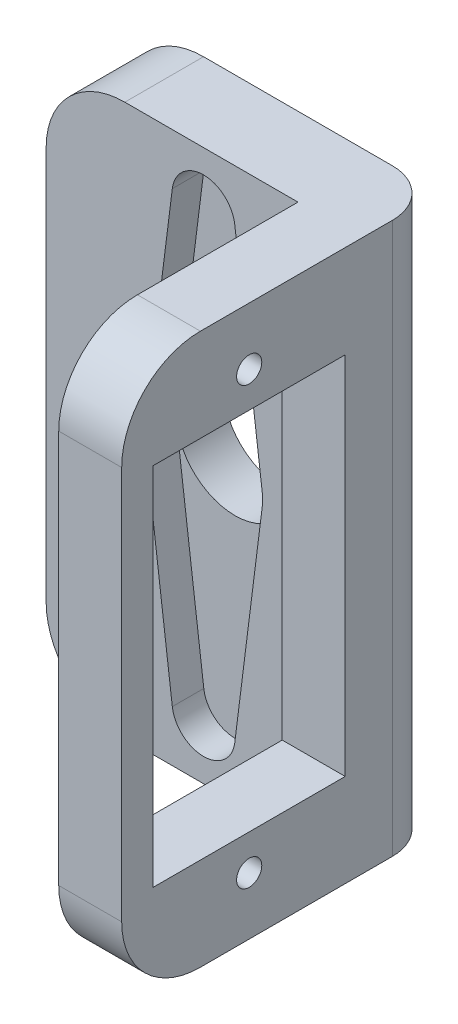
ISO-10303-21;
HEADER;
FILE_DESCRIPTION(('STEP AP214'),'2;1');
FILE_NAME('part.step','',(''),(''),'','','');
FILE_SCHEMA(('AUTOMOTIVE_DESIGN { 1 0 10303 214 1 1 1 1 }'));
ENDSEC;
DATA;
#1=APPLICATION_CONTEXT('core data for automotive mechanical design processes');
#2=APPLICATION_PROTOCOL_DEFINITION('international standard','automotive_design',2000,#1);
#3=PRODUCT_CONTEXT('',#1,'mechanical');
#4=PRODUCT('Part','Part','',(#3));
#5=PRODUCT_RELATED_PRODUCT_CATEGORY('part','',(#4));
#6=PRODUCT_DEFINITION_FORMATION('','',#4);
#7=PRODUCT_DEFINITION_CONTEXT('part definition',#1,'design');
#8=PRODUCT_DEFINITION('design','',#6,#7);
#9=PRODUCT_DEFINITION_SHAPE('','',#8);
#10=(LENGTH_UNIT() NAMED_UNIT(*) SI_UNIT(.MILLI.,.METRE.));
#11=(NAMED_UNIT(*) PLANE_ANGLE_UNIT() SI_UNIT($,.RADIAN.));
#12=(NAMED_UNIT(*) SI_UNIT($,.STERADIAN.) SOLID_ANGLE_UNIT());
#13=UNCERTAINTY_MEASURE_WITH_UNIT(LENGTH_MEASURE(1.E-05),#10,'distance_accuracy_value','');
#14=(GEOMETRIC_REPRESENTATION_CONTEXT(3) GLOBAL_UNCERTAINTY_ASSIGNED_CONTEXT((#13)) GLOBAL_UNIT_ASSIGNED_CONTEXT((#10,
#11,#12)) REPRESENTATION_CONTEXT('',''));
#15=CARTESIAN_POINT('',(0.,0.,0.));
#16=DIRECTION('',(0.,0.,1.));
#17=DIRECTION('',(1.,0.,0.));
#18=AXIS2_PLACEMENT_3D('',#15,#16,#17);
#19=CARTESIAN_POINT('',(-5.,12.5,0.));
#20=DIRECTION('',(0.,0.,1.));
#21=DIRECTION('',(1.,0.,0.));
#22=AXIS2_PLACEMENT_3D('',#19,#20,#21);
#23=PLANE('',#22);
#24=DIRECTION('',(-0.125,-0.992156741649221,0.));
#25=VECTOR('',#24,1.);
#26=CARTESIAN_POINT('',(-1.98431348329844,14.25,0.));
#27=LINE('',#26,#25);
#28=CARTESIAN_POINT('',(-1.98431348329844,14.25,0.));
#29=VERTEX_POINT('',#28);
#30=CARTESIAN_POINT('',(-3.72058778118458,0.46875,0.));
#31=VERTEX_POINT('',#30);
#32=EDGE_CURVE('E309',#29,#31,#27,.T.);
#33=ORIENTED_EDGE('',*,*,#32,.F.);
#34=CARTESIAN_POINT('',(0.,14.,0.));
#35=DIRECTION('',(0.,0.,1.));
#36=DIRECTION('',(1.,0.,0.));
#37=AXIS2_PLACEMENT_3D('',#34,#35,#36);
#38=CIRCLE('',#37,2.);
#39=CARTESIAN_POINT('',(1.98431348329844,14.25,0.));
#40=VERTEX_POINT('',#39);
#41=EDGE_CURVE('E342',#40,#29,#38,.T.);
#42=ORIENTED_EDGE('',*,*,#41,.F.);
#43=DIRECTION('',(-0.125,0.992156741649221,0.));
#44=VECTOR('',#43,1.);
#45=CARTESIAN_POINT('',(1.98431348329844,14.25,0.));
#46=LINE('',#45,#44);
#47=CARTESIAN_POINT('',(3.72058778118458,0.46875,0.));
#48=VERTEX_POINT('',#47);
#49=EDGE_CURVE('E338',#48,#40,#46,.T.);
#50=ORIENTED_EDGE('',*,*,#49,.F.);
#51=CARTESIAN_POINT('',(0.,0.,0.));
#52=DIRECTION('',(0.,0.,1.));
#53=DIRECTION('',(1.,0.,0.));
#54=AXIS2_PLACEMENT_3D('',#51,#52,#53);
#55=CIRCLE('',#54,3.75);
#56=CARTESIAN_POINT('',(3.72058778118458,-0.468750000000001,0.));
#57=VERTEX_POINT('',#56);
#58=EDGE_CURVE('E352',#57,#48,#55,.T.);
#59=ORIENTED_EDGE('',*,*,#58,.F.);
#60=DIRECTION('',(0.125,0.992156741649221,0.));
#61=VECTOR('',#60,1.);
#62=CARTESIAN_POINT('',(1.98431348329844,-14.25,0.));
#63=LINE('',#62,#61);
#64=CARTESIAN_POINT('',(1.98431348329844,-14.25,0.));
#65=VERTEX_POINT('',#64);
#66=EDGE_CURVE('E335',#65,#57,#63,.T.);
#67=ORIENTED_EDGE('',*,*,#66,.F.);
#68=CARTESIAN_POINT('',(0.,-14.,0.));
#69=DIRECTION('',(0.,0.,1.));
#70=DIRECTION('',(1.,0.,0.));
#71=AXIS2_PLACEMENT_3D('',#68,#69,#70);
#72=CIRCLE('',#71,2.);
#73=CARTESIAN_POINT('',(-1.98431348329844,-14.25,0.));
#74=VERTEX_POINT('',#73);
#75=EDGE_CURVE('E331',#74,#65,#72,.T.);
#76=ORIENTED_EDGE('',*,*,#75,.F.);
#77=DIRECTION('',(0.125,-0.992156741649221,0.));
#78=VECTOR('',#77,1.);
#79=CARTESIAN_POINT('',(-3.72058778118458,-0.46875,0.));
#80=LINE('',#79,#78);
#81=CARTESIAN_POINT('',(-3.72058778118458,-0.46875,0.));
#82=VERTEX_POINT('',#81);
#83=EDGE_CURVE('E294',#82,#74,#80,.T.);
#84=ORIENTED_EDGE('',*,*,#83,.F.);
#85=EDGE_CURVE('E379',#31,#82,#55,.T.);
#86=ORIENTED_EDGE('',*,*,#85,.F.);
#87=EDGE_LOOP('',(#33,#42,#50,#59,#67,#76,#84,#86));
#88=FACE_BOUND('',#87,.T.);
#89=DIRECTION('',(1.,0.,0.));
#90=VECTOR('',#89,1.);
#91=CARTESIAN_POINT('',(10.,-17.5,0.));
#92=LINE('',#91,#90);
#93=CARTESIAN_POINT('',(-5.,-17.5,0.));
#94=VERTEX_POINT('',#93);
#95=CARTESIAN_POINT('',(6.,-17.5,0.));
#96=VERTEX_POINT('',#95);
#97=EDGE_CURVE('E387',#94,#96,#92,.T.);
#98=ORIENTED_EDGE('',*,*,#97,.T.);
#99=DIRECTION('',(0.,1.,0.));
#100=VECTOR('',#99,1.);
#101=CARTESIAN_POINT('',(6.,12.5,0.));
#102=LINE('',#101,#100);
#103=CARTESIAN_POINT('',(6.,17.5,0.));
#104=VERTEX_POINT('',#103);
#105=EDGE_CURVE('E441',#96,#104,#102,.T.);
#106=ORIENTED_EDGE('',*,*,#105,.T.);
#107=DIRECTION('',(-1.,0.,0.));
#108=VECTOR('',#107,1.);
#109=CARTESIAN_POINT('',(10.,17.5,0.));
#110=LINE('',#109,#108);
#111=CARTESIAN_POINT('',(-5.,17.5,0.));
#112=VERTEX_POINT('',#111);
#113=EDGE_CURVE('E378',#104,#112,#110,.T.);
#114=ORIENTED_EDGE('',*,*,#113,.T.);
#115=CARTESIAN_POINT('',(-5.,12.5,0.));
#116=DIRECTION('',(0.,0.,1.));
#117=DIRECTION('',(1.,0.,0.));
#118=AXIS2_PLACEMENT_3D('',#115,#116,#117);
#119=CIRCLE('',#118,5.);
#120=CARTESIAN_POINT('',(-10.,12.5,0.));
#121=VERTEX_POINT('',#120);
#122=EDGE_CURVE('E405',#112,#121,#119,.T.);
#123=ORIENTED_EDGE('',*,*,#122,.T.);
#124=DIRECTION('',(0.,-1.,0.));
#125=VECTOR('',#124,1.);
#126=CARTESIAN_POINT('',(-10.,-12.5,0.));
#127=LINE('',#126,#125);
#128=CARTESIAN_POINT('',(-10.,-12.5,0.));
#129=VERTEX_POINT('',#128);
#130=EDGE_CURVE('E409',#121,#129,#127,.T.);
#131=ORIENTED_EDGE('',*,*,#130,.T.);
#132=CARTESIAN_POINT('',(-5.,-12.5,0.));
#133=DIRECTION('',(0.,0.,1.));
#134=DIRECTION('',(-1.,0.,0.));
#135=AXIS2_PLACEMENT_3D('',#132,#133,#134);
#136=CIRCLE('',#135,5.);
#137=EDGE_CURVE('E413',#129,#94,#136,.T.);
#138=ORIENTED_EDGE('',*,*,#137,.T.);
#139=EDGE_LOOP('',(#98,#106,#114,#123,#131,#138));
#140=FACE_BOUND('',#139,.T.);
#141=ADVANCED_FACE('F45',(#88,#140),#23,.T.);
#142=CARTESIAN_POINT('',(0.,0.,-5.));
#143=DIRECTION('',(0.,0.,1.));
#144=DIRECTION('',(1.,0.,0.));
#145=AXIS2_PLACEMENT_3D('',#142,#143,#144);
#146=CYLINDRICAL_SURFACE('',#145,3.75);
#147=CARTESIAN_POINT('',(0.,0.,-5.));
#148=DIRECTION('',(0.,0.,1.));
#149=DIRECTION('',(1.,0.,0.));
#150=AXIS2_PLACEMENT_3D('',#147,#148,#149);
#151=CIRCLE('',#150,3.75);
#152=CARTESIAN_POINT('',(3.75,0.,-5.));
#153=VERTEX_POINT('',#152);
#154=EDGE_CURVE('E374',#153,#153,#151,.T.);
#155=ORIENTED_EDGE('',*,*,#154,.F.);
#156=EDGE_LOOP('',(#155));
#157=FACE_BOUND('',#156,.T.);
#158=CARTESIAN_POINT('',(0.,0.,-2.));
#159=DIRECTION('',(0.,0.,1.));
#160=DIRECTION('',(1.,0.,0.));
#161=AXIS2_PLACEMENT_3D('',#158,#159,#160);
#162=CIRCLE('',#161,3.75);
#163=CARTESIAN_POINT('',(3.72058778118458,-0.468750000000001,-2.));
#164=VERTEX_POINT('',#163);
#165=CARTESIAN_POINT('',(-3.72058778118458,-0.46875,-2.));
#166=VERTEX_POINT('',#165);
#167=EDGE_CURVE('E438',#164,#166,#162,.F.);
#168=ORIENTED_EDGE('',*,*,#167,.F.);
#169=DIRECTION('',(0.,0.,1.));
#170=VECTOR('',#169,1.);
#171=CARTESIAN_POINT('',(3.72058778118458,-0.468750000000001,-2.));
#172=LINE('',#171,#170);
#173=EDGE_CURVE('E362',#164,#57,#172,.T.);
#174=ORIENTED_EDGE('',*,*,#173,.T.);
#175=ORIENTED_EDGE('',*,*,#58,.T.);
#176=DIRECTION('',(0.,0.,1.));
#177=VECTOR('',#176,1.);
#178=CARTESIAN_POINT('',(3.72058778118458,0.46875,-2.));
#179=LINE('',#178,#177);
#180=CARTESIAN_POINT('',(3.72058778118458,0.46875,-2.));
#181=VERTEX_POINT('',#180);
#182=EDGE_CURVE('E359',#181,#48,#179,.T.);
#183=ORIENTED_EDGE('',*,*,#182,.F.);
#184=CARTESIAN_POINT('',(-3.72058778118458,0.46875,-2.));
#185=VERTEX_POINT('',#184);
#186=EDGE_CURVE('E422',#185,#181,#162,.F.);
#187=ORIENTED_EDGE('',*,*,#186,.F.);
#188=DIRECTION('',(0.,0.,1.));
#189=VECTOR('',#188,1.);
#190=CARTESIAN_POINT('',(-3.72058778118458,0.46875,-2.));
#191=LINE('',#190,#189);
#192=EDGE_CURVE('E348',#185,#31,#191,.T.);
#193=ORIENTED_EDGE('',*,*,#192,.T.);
#194=ORIENTED_EDGE('',*,*,#85,.T.);
#195=DIRECTION('',(0.,0.,1.));
#196=VECTOR('',#195,1.);
#197=CARTESIAN_POINT('',(-3.72058778118458,-0.46875,-2.));
#198=LINE('',#197,#196);
#199=EDGE_CURVE('E327',#166,#82,#198,.T.);
#200=ORIENTED_EDGE('',*,*,#199,.F.);
#201=EDGE_LOOP('',(#168,#174,#175,#183,#187,#193,#194,#200));
#202=FACE_BOUND('',#201,.T.);
#203=ADVANCED_FACE('F457',(#157,#202),#146,.F.);
#204=CARTESIAN_POINT('',(10.,-17.5,-5.));
#205=DIRECTION('',(1.,0.,0.));
#206=DIRECTION('',(0.,0.,-1.));
#207=AXIS2_PLACEMENT_3D('',#204,#205,#206);
#208=PLANE('',#207);
#209=DIRECTION('',(0.,0.,1.));
#210=VECTOR('',#209,1.);
#211=CARTESIAN_POINT('',(10.,-17.5,-5.));
#212=LINE('',#211,#210);
#213=CARTESIAN_POINT('',(10.,-17.5,-2.));
#214=VERTEX_POINT('',#213);
#215=CARTESIAN_POINT('',(10.,-17.5,10.2));
#216=VERTEX_POINT('',#215);
#217=EDGE_CURVE('E419',#214,#216,#212,.T.);
#218=ORIENTED_EDGE('',*,*,#217,.F.);
#219=DIRECTION('',(0.,1.,0.));
#220=VECTOR('',#219,1.);
#221=CARTESIAN_POINT('',(10.,17.5,-2.));
#222=LINE('',#221,#220);
#223=CARTESIAN_POINT('',(10.,17.5,-2.));
#224=VERTEX_POINT('',#223);
#225=EDGE_CURVE('E444',#214,#224,#222,.T.);
#226=ORIENTED_EDGE('',*,*,#225,.T.);
#227=DIRECTION('',(0.,0.,1.));
#228=VECTOR('',#227,1.);
#229=CARTESIAN_POINT('',(10.,17.5,-5.));
#230=LINE('',#229,#228);
#231=CARTESIAN_POINT('',(10.,17.5,10.2));
#232=VERTEX_POINT('',#231);
#233=EDGE_CURVE('E402',#224,#232,#230,.T.);
#234=ORIENTED_EDGE('',*,*,#233,.T.);
#235=CARTESIAN_POINT('',(10.,12.5,10.2));
#236=DIRECTION('',(1.,0.,0.));
#237=DIRECTION('',(0.,0.,1.));
#238=AXIS2_PLACEMENT_3D('',#235,#236,#237);
#239=CIRCLE('',#238,5.);
#240=CARTESIAN_POINT('',(10.,12.5,15.2));
#241=VERTEX_POINT('',#240);
#242=EDGE_CURVE('E253',#232,#241,#239,.T.);
#243=ORIENTED_EDGE('',*,*,#242,.T.);
#244=DIRECTION('',(0.,-1.,0.));
#245=VECTOR('',#244,1.);
#246=CARTESIAN_POINT('',(10.,12.5,15.2));
#247=LINE('',#246,#245);
#248=CARTESIAN_POINT('',(10.,-12.5,15.2));
#249=VERTEX_POINT('',#248);
#250=EDGE_CURVE('E283',#241,#249,#247,.T.);
#251=ORIENTED_EDGE('',*,*,#250,.T.);
#252=CARTESIAN_POINT('',(10.,-12.5,10.2));
#253=DIRECTION('',(1.,0.,0.));
#254=DIRECTION('',(0.,0.,-1.));
#255=AXIS2_PLACEMENT_3D('',#252,#253,#254);
#256=CIRCLE('',#255,5.);
#257=EDGE_CURVE('E263',#249,#216,#256,.T.);
#258=ORIENTED_EDGE('',*,*,#257,.T.);
#259=EDGE_LOOP('',(#218,#226,#234,#243,#251,#258));
#260=FACE_BOUND('',#259,.T.);
#261=CARTESIAN_POINT('',(10.,-13.85,7.1));
#262=DIRECTION('',(1.,0.,0.));
#263=DIRECTION('',(0.,0.,-1.));
#264=AXIS2_PLACEMENT_3D('',#261,#262,#263);
#265=CIRCLE('',#264,0.800000000000002);
#266=CARTESIAN_POINT('',(10.,-13.85,6.3));
#267=VERTEX_POINT('',#266);
#268=EDGE_CURVE('E539',#267,#267,#265,.T.);
#269=ORIENTED_EDGE('',*,*,#268,.F.);
#270=EDGE_LOOP('',(#269));
#271=FACE_BOUND('',#270,.T.);
#272=CARTESIAN_POINT('',(10.,13.85,7.10000000000001));
#273=DIRECTION('',(1.,0.,0.));
#274=DIRECTION('',(0.,0.,-1.));
#275=AXIS2_PLACEMENT_3D('',#272,#273,#274);
#276=CIRCLE('',#275,0.800000000000002);
#277=CARTESIAN_POINT('',(10.,13.85,6.30000000000001));
#278=VERTEX_POINT('',#277);
#279=EDGE_CURVE('E234',#278,#278,#276,.T.);
#280=ORIENTED_EDGE('',*,*,#279,.F.);
#281=EDGE_LOOP('',(#280));
#282=FACE_BOUND('',#281,.T.);
#283=DIRECTION('',(0.,1.,0.));
#284=VECTOR('',#283,1.);
#285=CARTESIAN_POINT('',(10.,-11.6,1.));
#286=LINE('',#285,#284);
#287=CARTESIAN_POINT('',(10.,-11.6,1.));
#288=VERTEX_POINT('',#287);
#289=CARTESIAN_POINT('',(10.,11.6,0.999999999999999));
#290=VERTEX_POINT('',#289);
#291=EDGE_CURVE('E207',#288,#290,#286,.T.);
#292=ORIENTED_EDGE('',*,*,#291,.F.);
#293=DIRECTION('',(0.,0.,-1.));
#294=VECTOR('',#293,1.);
#295=CARTESIAN_POINT('',(10.,-11.6,13.2));
#296=LINE('',#295,#294);
#297=CARTESIAN_POINT('',(10.,-11.6,13.2));
#298=VERTEX_POINT('',#297);
#299=EDGE_CURVE('E227',#298,#288,#296,.T.);
#300=ORIENTED_EDGE('',*,*,#299,.F.);
#301=DIRECTION('',(0.,-1.,0.));
#302=VECTOR('',#301,1.);
#303=CARTESIAN_POINT('',(10.,-11.6,13.2));
#304=LINE('',#303,#302);
#305=CARTESIAN_POINT('',(10.,11.6,13.2));
#306=VERTEX_POINT('',#305);
#307=EDGE_CURVE('E231',#306,#298,#304,.T.);
#308=ORIENTED_EDGE('',*,*,#307,.F.);
#309=DIRECTION('',(0.,0.,1.));
#310=VECTOR('',#309,1.);
#311=CARTESIAN_POINT('',(10.,11.6,13.2));
#312=LINE('',#311,#310);
#313=EDGE_CURVE('E243',#290,#306,#312,.T.);
#314=ORIENTED_EDGE('',*,*,#313,.F.);
#315=EDGE_LOOP('',(#292,#300,#308,#314));
#316=FACE_BOUND('',#315,.T.);
#317=ADVANCED_FACE('F505',(#260,#271,#282,#316),#208,.T.);
#318=CARTESIAN_POINT('',(10.,-17.5,-5.));
#319=DIRECTION('',(0.,-1.,0.));
#320=DIRECTION('',(1.,0.,0.));
#321=AXIS2_PLACEMENT_3D('',#318,#319,#320);
#322=PLANE('',#321);
#323=DIRECTION('',(1.,0.,0.));
#324=VECTOR('',#323,1.);
#325=CARTESIAN_POINT('',(10.,-17.5,-5.));
#326=LINE('',#325,#324);
#327=CARTESIAN_POINT('',(-5.,-17.5,-5.));
#328=VERTEX_POINT('',#327);
#329=CARTESIAN_POINT('',(7.,-17.5,-5.));
#330=VERTEX_POINT('',#329);
#331=EDGE_CURVE('E399',#328,#330,#326,.T.);
#332=ORIENTED_EDGE('',*,*,#331,.T.);
#333=CARTESIAN_POINT('',(7.,-17.5,-2.));
#334=DIRECTION('',(0.,-1.,0.));
#335=DIRECTION('',(1.,0.,0.));
#336=AXIS2_PLACEMENT_3D('',#333,#334,#335);
#337=CIRCLE('',#336,3.);
#338=EDGE_CURVE('E11',#330,#214,#337,.T.);
#339=ORIENTED_EDGE('',*,*,#338,.T.);
#340=ORIENTED_EDGE('',*,*,#217,.T.);
#341=DIRECTION('',(1.,0.,0.));
#342=VECTOR('',#341,1.);
#343=CARTESIAN_POINT('',(6.,-17.5,10.2));
#344=LINE('',#343,#342);
#345=CARTESIAN_POINT('',(6.,-17.5,10.2));
#346=VERTEX_POINT('',#345);
#347=EDGE_CURVE('E290',#346,#216,#344,.T.);
#348=ORIENTED_EDGE('',*,*,#347,.F.);
#349=DIRECTION('',(0.,0.,-1.));
#350=VECTOR('',#349,1.);
#351=CARTESIAN_POINT('',(6.,-17.5,-5.));
#352=LINE('',#351,#350);
#353=EDGE_CURVE('E275',#346,#96,#352,.T.);
#354=ORIENTED_EDGE('',*,*,#353,.T.);
#355=ORIENTED_EDGE('',*,*,#97,.F.);
#356=DIRECTION('',(0.,0.,1.));
#357=VECTOR('',#356,1.);
#358=CARTESIAN_POINT('',(-5.,-17.5,-5.));
#359=LINE('',#358,#357);
#360=EDGE_CURVE('E423',#328,#94,#359,.T.);
#361=ORIENTED_EDGE('',*,*,#360,.F.);
#362=EDGE_LOOP('',(#332,#339,#340,#348,#354,#355,#361));
#363=FACE_BOUND('',#362,.T.);
#364=ADVANCED_FACE('F511',(#363),#322,.T.);
#365=CARTESIAN_POINT('',(-5.,-12.5,-5.));
#366=DIRECTION('',(0.,0.,1.));
#367=DIRECTION('',(1.,0.,0.));
#368=AXIS2_PLACEMENT_3D('',#365,#366,#367);
#369=CYLINDRICAL_SURFACE('',#368,5.);
#370=ORIENTED_EDGE('',*,*,#137,.F.);
#371=DIRECTION('',(0.,0.,1.));
#372=VECTOR('',#371,1.);
#373=CARTESIAN_POINT('',(-10.,-12.5,-5.));
#374=LINE('',#373,#372);
#375=CARTESIAN_POINT('',(-10.,-12.5,-5.));
#376=VERTEX_POINT('',#375);
#377=EDGE_CURVE('E426',#376,#129,#374,.T.);
#378=ORIENTED_EDGE('',*,*,#377,.F.);
#379=CARTESIAN_POINT('',(-5.,-12.5,-5.));
#380=DIRECTION('',(0.,0.,1.));
#381=DIRECTION('',(-1.,0.,0.));
#382=AXIS2_PLACEMENT_3D('',#379,#380,#381);
#383=CIRCLE('',#382,5.);
#384=EDGE_CURVE('E395',#376,#328,#383,.T.);
#385=ORIENTED_EDGE('',*,*,#384,.T.);
#386=ORIENTED_EDGE('',*,*,#360,.T.);
#387=EDGE_LOOP('',(#370,#378,#385,#386));
#388=FACE_BOUND('',#387,.T.);
#389=ADVANCED_FACE('F514',(#388),#369,.T.);
#390=CARTESIAN_POINT('',(-10.,-12.5,-5.));
#391=DIRECTION('',(-1.,0.,0.));
#392=DIRECTION('',(0.,0.,1.));
#393=AXIS2_PLACEMENT_3D('',#390,#391,#392);
#394=PLANE('',#393);
#395=ORIENTED_EDGE('',*,*,#130,.F.);
#396=DIRECTION('',(0.,0.,1.));
#397=VECTOR('',#396,1.);
#398=CARTESIAN_POINT('',(-10.,12.5,-5.));
#399=LINE('',#398,#397);
#400=CARTESIAN_POINT('',(-10.,12.5,-5.));
#401=VERTEX_POINT('',#400);
#402=EDGE_CURVE('E429',#401,#121,#399,.T.);
#403=ORIENTED_EDGE('',*,*,#402,.F.);
#404=DIRECTION('',(0.,-1.,0.));
#405=VECTOR('',#404,1.);
#406=CARTESIAN_POINT('',(-10.,-12.5,-5.));
#407=LINE('',#406,#405);
#408=EDGE_CURVE('E391',#401,#376,#407,.T.);
#409=ORIENTED_EDGE('',*,*,#408,.T.);
#410=ORIENTED_EDGE('',*,*,#377,.T.);
#411=EDGE_LOOP('',(#395,#403,#409,#410));
#412=FACE_BOUND('',#411,.T.);
#413=ADVANCED_FACE('F518',(#412),#394,.T.);
#414=CARTESIAN_POINT('',(-5.,12.5,-5.));
#415=DIRECTION('',(0.,0.,1.));
#416=DIRECTION('',(1.,0.,0.));
#417=AXIS2_PLACEMENT_3D('',#414,#415,#416);
#418=CYLINDRICAL_SURFACE('',#417,5.);
#419=ORIENTED_EDGE('',*,*,#122,.F.);
#420=DIRECTION('',(0.,0.,1.));
#421=VECTOR('',#420,1.);
#422=CARTESIAN_POINT('',(-5.,17.5,-5.));
#423=LINE('',#422,#421);
#424=CARTESIAN_POINT('',(-5.,17.5,-5.));
#425=VERTEX_POINT('',#424);
#426=EDGE_CURVE('E432',#425,#112,#423,.T.);
#427=ORIENTED_EDGE('',*,*,#426,.F.);
#428=CARTESIAN_POINT('',(-5.,12.5,-5.));
#429=DIRECTION('',(0.,0.,1.));
#430=DIRECTION('',(1.,0.,0.));
#431=AXIS2_PLACEMENT_3D('',#428,#429,#430);
#432=CIRCLE('',#431,5.);
#433=EDGE_CURVE('E386',#425,#401,#432,.T.);
#434=ORIENTED_EDGE('',*,*,#433,.T.);
#435=ORIENTED_EDGE('',*,*,#402,.T.);
#436=EDGE_LOOP('',(#419,#427,#434,#435));
#437=FACE_BOUND('',#436,.T.);
#438=ADVANCED_FACE('F522',(#437),#418,.T.);
#439=CARTESIAN_POINT('',(10.,17.5,-5.));
#440=DIRECTION('',(0.,1.,0.));
#441=DIRECTION('',(0.,0.,1.));
#442=AXIS2_PLACEMENT_3D('',#439,#440,#441);
#443=PLANE('',#442);
#444=ORIENTED_EDGE('',*,*,#233,.F.);
#445=CARTESIAN_POINT('',(7.,17.5,-2.));
#446=DIRECTION('',(0.,1.,0.));
#447=DIRECTION('',(0.,0.,1.));
#448=AXIS2_PLACEMENT_3D('',#445,#446,#447);
#449=CIRCLE('',#448,3.);
#450=CARTESIAN_POINT('',(7.,17.5,-5.));
#451=VERTEX_POINT('',#450);
#452=EDGE_CURVE('E68',#224,#451,#449,.T.);
#453=ORIENTED_EDGE('',*,*,#452,.T.);
#454=DIRECTION('',(-1.,0.,0.));
#455=VECTOR('',#454,1.);
#456=CARTESIAN_POINT('',(10.,17.5,-5.));
#457=LINE('',#456,#455);
#458=EDGE_CURVE('E383',#451,#425,#457,.T.);
#459=ORIENTED_EDGE('',*,*,#458,.T.);
#460=ORIENTED_EDGE('',*,*,#426,.T.);
#461=ORIENTED_EDGE('',*,*,#113,.F.);
#462=DIRECTION('',(0.,0.,1.));
#463=VECTOR('',#462,1.);
#464=CARTESIAN_POINT('',(6.,17.5,-5.));
#465=LINE('',#464,#463);
#466=CARTESIAN_POINT('',(6.,17.5,10.2));
#467=VERTEX_POINT('',#466);
#468=EDGE_CURVE('E259',#104,#467,#465,.T.);
#469=ORIENTED_EDGE('',*,*,#468,.T.);
#470=DIRECTION('',(1.,0.,0.));
#471=VECTOR('',#470,1.);
#472=CARTESIAN_POINT('',(6.,17.5,10.2));
#473=LINE('',#472,#471);
#474=EDGE_CURVE('E279',#467,#232,#473,.T.);
#475=ORIENTED_EDGE('',*,*,#474,.T.);
#476=EDGE_LOOP('',(#444,#453,#459,#460,#461,#469,#475));
#477=FACE_BOUND('',#476,.T.);
#478=ADVANCED_FACE('F526',(#477),#443,.T.);
#479=CARTESIAN_POINT('',(-5.,12.5,-5.));
#480=DIRECTION('',(0.,0.,1.));
#481=DIRECTION('',(1.,0.,0.));
#482=AXIS2_PLACEMENT_3D('',#479,#480,#481);
#483=PLANE('',#482);
#484=ORIENTED_EDGE('',*,*,#458,.F.);
#485=DIRECTION('',(0.,1.,0.));
#486=VECTOR('',#485,1.);
#487=CARTESIAN_POINT('',(7.,-17.5,-5.));
#488=LINE('',#487,#486);
#489=EDGE_CURVE('E54',#451,#330,#488,.F.);
#490=ORIENTED_EDGE('',*,*,#489,.T.);
#491=ORIENTED_EDGE('',*,*,#331,.F.);
#492=ORIENTED_EDGE('',*,*,#384,.F.);
#493=ORIENTED_EDGE('',*,*,#408,.F.);
#494=ORIENTED_EDGE('',*,*,#433,.F.);
#495=EDGE_LOOP('',(#484,#490,#491,#492,#493,#494));
#496=FACE_BOUND('',#495,.T.);
#497=ORIENTED_EDGE('',*,*,#154,.T.);
#498=EDGE_LOOP('',(#497));
#499=FACE_BOUND('',#498,.T.);
#500=ADVANCED_FACE('F510',(#496,#499),#483,.F.);
#501=CARTESIAN_POINT('',(0.,0.,-2.));
#502=DIRECTION('',(0.,0.,1.));
#503=DIRECTION('',(1.,0.,0.));
#504=AXIS2_PLACEMENT_3D('',#501,#502,#503);
#505=PLANE('',#504);
#506=ORIENTED_EDGE('',*,*,#186,.T.);
#507=DIRECTION('',(-0.125,0.992156741649221,0.));
#508=VECTOR('',#507,1.);
#509=CARTESIAN_POINT('',(1.98431348329844,14.25,-2.));
#510=LINE('',#509,#508);
#511=CARTESIAN_POINT('',(1.98431348329844,14.25,-2.));
#512=VERTEX_POINT('',#511);
#513=EDGE_CURVE('E316',#181,#512,#510,.T.);
#514=ORIENTED_EDGE('',*,*,#513,.T.);
#515=CARTESIAN_POINT('',(0.,14.,-2.));
#516=DIRECTION('',(0.,0.,1.));
#517=DIRECTION('',(1.,0.,0.));
#518=AXIS2_PLACEMENT_3D('',#515,#516,#517);
#519=CIRCLE('',#518,2.);
#520=CARTESIAN_POINT('',(-1.98431348329844,14.25,-2.));
#521=VERTEX_POINT('',#520);
#522=EDGE_CURVE('E320',#512,#521,#519,.T.);
#523=ORIENTED_EDGE('',*,*,#522,.T.);
#524=DIRECTION('',(-0.125,-0.992156741649221,0.));
#525=VECTOR('',#524,1.);
#526=CARTESIAN_POINT('',(-1.98431348329844,14.25,-2.));
#527=LINE('',#526,#525);
#528=EDGE_CURVE('E324',#521,#185,#527,.T.);
#529=ORIENTED_EDGE('',*,*,#528,.T.);
#530=EDGE_LOOP('',(#506,#514,#523,#529));
#531=FACE_BOUND('',#530,.T.);
#532=ADVANCED_FACE('F484',(#531),#505,.T.);
#533=CARTESIAN_POINT('',(1.98431348329844,14.25,-2.));
#534=DIRECTION('',(0.992156741649222,0.125,0.));
#535=DIRECTION('',(-0.125,0.992156741649222,0.));
#536=AXIS2_PLACEMENT_3D('',#533,#534,#535);
#537=PLANE('',#536);
#538=ORIENTED_EDGE('',*,*,#49,.T.);
#539=DIRECTION('',(0.,0.,1.));
#540=VECTOR('',#539,1.);
#541=CARTESIAN_POINT('',(1.98431348329844,14.25,-2.));
#542=LINE('',#541,#540);
#543=EDGE_CURVE('E356',#512,#40,#542,.T.);
#544=ORIENTED_EDGE('',*,*,#543,.F.);
#545=ORIENTED_EDGE('',*,*,#513,.F.);
#546=ORIENTED_EDGE('',*,*,#182,.T.);
#547=EDGE_LOOP('',(#538,#544,#545,#546));
#548=FACE_BOUND('',#547,.T.);
#549=ADVANCED_FACE('F480',(#548),#537,.F.);
#550=CARTESIAN_POINT('',(-1.98431348329844,14.25,-2.));
#551=DIRECTION('',(-0.992156741649222,0.125,0.));
#552=DIRECTION('',(-0.125,-0.992156741649222,0.));
#553=AXIS2_PLACEMENT_3D('',#550,#551,#552);
#554=PLANE('',#553);
#555=ORIENTED_EDGE('',*,*,#32,.T.);
#556=ORIENTED_EDGE('',*,*,#192,.F.);
#557=ORIENTED_EDGE('',*,*,#528,.F.);
#558=DIRECTION('',(0.,0.,1.));
#559=VECTOR('',#558,1.);
#560=CARTESIAN_POINT('',(-1.98431348329844,14.25,-2.));
#561=LINE('',#560,#559);
#562=EDGE_CURVE('E353',#521,#29,#561,.T.);
#563=ORIENTED_EDGE('',*,*,#562,.T.);
#564=EDGE_LOOP('',(#555,#556,#557,#563));
#565=FACE_BOUND('',#564,.T.);
#566=ADVANCED_FACE('F487',(#565),#554,.F.);
#567=CARTESIAN_POINT('',(0.,14.,-2.));
#568=DIRECTION('',(0.,0.,1.));
#569=DIRECTION('',(1.,0.,0.));
#570=AXIS2_PLACEMENT_3D('',#567,#568,#569);
#571=CYLINDRICAL_SURFACE('',#570,2.);
#572=ORIENTED_EDGE('',*,*,#41,.T.);
#573=ORIENTED_EDGE('',*,*,#562,.F.);
#574=ORIENTED_EDGE('',*,*,#522,.F.);
#575=ORIENTED_EDGE('',*,*,#543,.T.);
#576=EDGE_LOOP('',(#572,#573,#574,#575));
#577=FACE_BOUND('',#576,.T.);
#578=ADVANCED_FACE('F489',(#577),#571,.F.);
#579=ORIENTED_EDGE('',*,*,#167,.T.);
#580=DIRECTION('',(0.125,-0.992156741649221,0.));
#581=VECTOR('',#580,1.);
#582=CARTESIAN_POINT('',(-3.72058778118458,-0.46875,-2.));
#583=LINE('',#582,#581);
#584=CARTESIAN_POINT('',(-1.98431348329844,-14.25,-2.));
#585=VERTEX_POINT('',#584);
#586=EDGE_CURVE('E304',#166,#585,#583,.T.);
#587=ORIENTED_EDGE('',*,*,#586,.T.);
#588=CARTESIAN_POINT('',(0.,-14.,-2.));
#589=DIRECTION('',(0.,0.,1.));
#590=DIRECTION('',(1.,0.,0.));
#591=AXIS2_PLACEMENT_3D('',#588,#589,#590);
#592=CIRCLE('',#591,2.);
#593=CARTESIAN_POINT('',(1.98431348329844,-14.25,-2.));
#594=VERTEX_POINT('',#593);
#595=EDGE_CURVE('E308',#585,#594,#592,.T.);
#596=ORIENTED_EDGE('',*,*,#595,.T.);
#597=DIRECTION('',(0.125,0.992156741649221,0.));
#598=VECTOR('',#597,1.);
#599=CARTESIAN_POINT('',(1.98431348329844,-14.25,-2.));
#600=LINE('',#599,#598);
#601=EDGE_CURVE('E313',#594,#164,#600,.T.);
#602=ORIENTED_EDGE('',*,*,#601,.T.);
#603=EDGE_LOOP('',(#579,#587,#596,#602));
#604=FACE_BOUND('',#603,.T.);
#605=ADVANCED_FACE('F472',(#604),#505,.T.);
#606=CARTESIAN_POINT('',(1.98431348329844,-14.25,-2.));
#607=DIRECTION('',(0.992156741649222,-0.125,0.));
#608=DIRECTION('',(0.125,0.992156741649222,0.));
#609=AXIS2_PLACEMENT_3D('',#606,#607,#608);
#610=PLANE('',#609);
#611=ORIENTED_EDGE('',*,*,#66,.T.);
#612=ORIENTED_EDGE('',*,*,#173,.F.);
#613=ORIENTED_EDGE('',*,*,#601,.F.);
#614=DIRECTION('',(0.,0.,1.));
#615=VECTOR('',#614,1.);
#616=CARTESIAN_POINT('',(1.98431348329844,-14.25,-2.));
#617=LINE('',#616,#615);
#618=EDGE_CURVE('E366',#594,#65,#617,.T.);
#619=ORIENTED_EDGE('',*,*,#618,.T.);
#620=EDGE_LOOP('',(#611,#612,#613,#619));
#621=FACE_BOUND('',#620,.T.);
#622=ADVANCED_FACE('F496',(#621),#610,.F.);
#623=CARTESIAN_POINT('',(0.,-14.,-2.));
#624=DIRECTION('',(0.,0.,1.));
#625=DIRECTION('',(1.,0.,0.));
#626=AXIS2_PLACEMENT_3D('',#623,#624,#625);
#627=CYLINDRICAL_SURFACE('',#626,2.);
#628=ORIENTED_EDGE('',*,*,#75,.T.);
#629=ORIENTED_EDGE('',*,*,#618,.F.);
#630=ORIENTED_EDGE('',*,*,#595,.F.);
#631=DIRECTION('',(0.,0.,1.));
#632=VECTOR('',#631,1.);
#633=CARTESIAN_POINT('',(-1.98431348329844,-14.25,-2.));
#634=LINE('',#633,#632);
#635=EDGE_CURVE('E369',#585,#74,#634,.T.);
#636=ORIENTED_EDGE('',*,*,#635,.T.);
#637=EDGE_LOOP('',(#628,#629,#630,#636));
#638=FACE_BOUND('',#637,.T.);
#639=ADVANCED_FACE('F682',(#638),#627,.F.);
#640=CARTESIAN_POINT('',(-3.72058778118458,-0.46875,-2.));
#641=DIRECTION('',(-0.992156741649222,-0.125,0.));
#642=DIRECTION('',(0.125,-0.992156741649222,0.));
#643=AXIS2_PLACEMENT_3D('',#640,#641,#642);
#644=PLANE('',#643);
#645=ORIENTED_EDGE('',*,*,#83,.T.);
#646=ORIENTED_EDGE('',*,*,#635,.F.);
#647=ORIENTED_EDGE('',*,*,#586,.F.);
#648=ORIENTED_EDGE('',*,*,#199,.T.);
#649=EDGE_LOOP('',(#645,#646,#647,#648));
#650=FACE_BOUND('',#649,.T.);
#651=ADVANCED_FACE('F468',(#650),#644,.F.);
#652=CARTESIAN_POINT('',(6.,-12.5,10.2));
#653=DIRECTION('',(1.,0.,0.));
#654=DIRECTION('',(0.,0.,-1.));
#655=AXIS2_PLACEMENT_3D('',#652,#653,#654);
#656=CYLINDRICAL_SURFACE('',#655,5.);
#657=ORIENTED_EDGE('',*,*,#257,.F.);
#658=DIRECTION('',(1.,0.,0.));
#659=VECTOR('',#658,1.);
#660=CARTESIAN_POINT('',(6.,-12.5,15.2));
#661=LINE('',#660,#659);
#662=CARTESIAN_POINT('',(6.,-12.5,15.2));
#663=VERTEX_POINT('',#662);
#664=EDGE_CURVE('E295',#663,#249,#661,.T.);
#665=ORIENTED_EDGE('',*,*,#664,.F.);
#666=CARTESIAN_POINT('',(6.,-12.5,10.2));
#667=DIRECTION('',(1.,0.,0.));
#668=DIRECTION('',(0.,0.,-1.));
#669=AXIS2_PLACEMENT_3D('',#666,#667,#668);
#670=CIRCLE('',#669,5.);
#671=EDGE_CURVE('E271',#663,#346,#670,.T.);
#672=ORIENTED_EDGE('',*,*,#671,.T.);
#673=ORIENTED_EDGE('',*,*,#347,.T.);
#674=EDGE_LOOP('',(#657,#665,#672,#673));
#675=FACE_BOUND('',#674,.T.);
#676=ADVANCED_FACE('F567',(#675),#656,.T.);
#677=CARTESIAN_POINT('',(6.,12.5,15.2));
#678=DIRECTION('',(0.,0.,1.));
#679=DIRECTION('',(0.,-1.,0.));
#680=AXIS2_PLACEMENT_3D('',#677,#678,#679);
#681=PLANE('',#680);
#682=ORIENTED_EDGE('',*,*,#250,.F.);
#683=DIRECTION('',(1.,0.,0.));
#684=VECTOR('',#683,1.);
#685=CARTESIAN_POINT('',(6.,12.5,15.2));
#686=LINE('',#685,#684);
#687=CARTESIAN_POINT('',(6.,12.5,15.2));
#688=VERTEX_POINT('',#687);
#689=EDGE_CURVE('E298',#688,#241,#686,.T.);
#690=ORIENTED_EDGE('',*,*,#689,.F.);
#691=DIRECTION('',(0.,-1.,0.));
#692=VECTOR('',#691,1.);
#693=CARTESIAN_POINT('',(6.,12.5,15.2));
#694=LINE('',#693,#692);
#695=EDGE_CURVE('E267',#688,#663,#694,.T.);
#696=ORIENTED_EDGE('',*,*,#695,.T.);
#697=ORIENTED_EDGE('',*,*,#664,.T.);
#698=EDGE_LOOP('',(#682,#690,#696,#697));
#699=FACE_BOUND('',#698,.T.);
#700=ADVANCED_FACE('F570',(#699),#681,.T.);
#701=CARTESIAN_POINT('',(6.,12.5,10.2));
#702=DIRECTION('',(1.,0.,0.));
#703=DIRECTION('',(0.,0.,-1.));
#704=AXIS2_PLACEMENT_3D('',#701,#702,#703);
#705=CYLINDRICAL_SURFACE('',#704,5.);
#706=ORIENTED_EDGE('',*,*,#242,.F.);
#707=ORIENTED_EDGE('',*,*,#474,.F.);
#708=CARTESIAN_POINT('',(6.,12.5,10.2));
#709=DIRECTION('',(1.,0.,0.));
#710=DIRECTION('',(0.,0.,1.));
#711=AXIS2_PLACEMENT_3D('',#708,#709,#710);
#712=CIRCLE('',#711,5.);
#713=EDGE_CURVE('E262',#467,#688,#712,.T.);
#714=ORIENTED_EDGE('',*,*,#713,.T.);
#715=ORIENTED_EDGE('',*,*,#689,.T.);
#716=EDGE_LOOP('',(#706,#707,#714,#715));
#717=FACE_BOUND('',#716,.T.);
#718=ADVANCED_FACE('F565',(#717),#705,.T.);
#719=CARTESIAN_POINT('',(6.,-12.5,10.2));
#720=DIRECTION('',(1.,0.,0.));
#721=DIRECTION('',(0.,0.,-1.));
#722=AXIS2_PLACEMENT_3D('',#719,#720,#721);
#723=PLANE('',#722);
#724=ORIENTED_EDGE('',*,*,#105,.F.);
#725=ORIENTED_EDGE('',*,*,#353,.F.);
#726=ORIENTED_EDGE('',*,*,#671,.F.);
#727=ORIENTED_EDGE('',*,*,#695,.F.);
#728=ORIENTED_EDGE('',*,*,#713,.F.);
#729=ORIENTED_EDGE('',*,*,#468,.F.);
#730=EDGE_LOOP('',(#724,#725,#726,#727,#728,#729));
#731=FACE_BOUND('',#730,.T.);
#732=CARTESIAN_POINT('',(6.,-13.85,7.1));
#733=DIRECTION('',(1.,0.,0.));
#734=DIRECTION('',(0.,0.,-1.));
#735=AXIS2_PLACEMENT_3D('',#732,#733,#734);
#736=CIRCLE('',#735,0.800000000000002);
#737=CARTESIAN_POINT('',(6.,-13.85,6.3));
#738=VERTEX_POINT('',#737);
#739=EDGE_CURVE('E607',#738,#738,#736,.T.);
#740=ORIENTED_EDGE('',*,*,#739,.T.);
#741=EDGE_LOOP('',(#740));
#742=FACE_BOUND('',#741,.T.);
#743=CARTESIAN_POINT('',(6.,13.85,7.10000000000001));
#744=DIRECTION('',(1.,0.,0.));
#745=DIRECTION('',(0.,0.,-1.));
#746=AXIS2_PLACEMENT_3D('',#743,#744,#745);
#747=CIRCLE('',#746,0.800000000000002);
#748=CARTESIAN_POINT('',(6.,13.85,6.30000000000001));
#749=VERTEX_POINT('',#748);
#750=EDGE_CURVE('E244',#749,#749,#747,.T.);
#751=ORIENTED_EDGE('',*,*,#750,.T.);
#752=EDGE_LOOP('',(#751));
#753=FACE_BOUND('',#752,.T.);
#754=DIRECTION('',(0.,0.,-1.));
#755=VECTOR('',#754,1.);
#756=CARTESIAN_POINT('',(6.,-11.6,13.2));
#757=LINE('',#756,#755);
#758=CARTESIAN_POINT('',(6.,-11.6,13.2));
#759=VERTEX_POINT('',#758);
#760=CARTESIAN_POINT('',(6.,-11.6,1.));
#761=VERTEX_POINT('',#760);
#762=EDGE_CURVE('E213',#759,#761,#757,.T.);
#763=ORIENTED_EDGE('',*,*,#762,.T.);
#764=DIRECTION('',(0.,1.,0.));
#765=VECTOR('',#764,1.);
#766=CARTESIAN_POINT('',(6.,-11.6,1.));
#767=LINE('',#766,#765);
#768=CARTESIAN_POINT('',(6.,11.6,1.));
#769=VERTEX_POINT('',#768);
#770=EDGE_CURVE('E204',#761,#769,#767,.T.);
#771=ORIENTED_EDGE('',*,*,#770,.T.);
#772=DIRECTION('',(0.,0.,1.));
#773=VECTOR('',#772,1.);
#774=CARTESIAN_POINT('',(6.,11.6,13.2));
#775=LINE('',#774,#773);
#776=CARTESIAN_POINT('',(6.,11.6,13.2));
#777=VERTEX_POINT('',#776);
#778=EDGE_CURVE('E217',#769,#777,#775,.T.);
#779=ORIENTED_EDGE('',*,*,#778,.T.);
#780=DIRECTION('',(0.,-1.,0.));
#781=VECTOR('',#780,1.);
#782=CARTESIAN_POINT('',(6.,-11.6,13.2));
#783=LINE('',#782,#781);
#784=EDGE_CURVE('E222',#777,#759,#783,.T.);
#785=ORIENTED_EDGE('',*,*,#784,.T.);
#786=EDGE_LOOP('',(#763,#771,#779,#785));
#787=FACE_BOUND('',#786,.T.);
#788=ADVANCED_FACE('F224',(#731,#742,#753,#787),#723,.F.);
#789=CARTESIAN_POINT('',(6.,-11.6,1.));
#790=DIRECTION('',(0.,0.,-1.));
#791=DIRECTION('',(-1.,0.,0.));
#792=AXIS2_PLACEMENT_3D('',#789,#790,#791);
#793=PLANE('',#792);
#794=ORIENTED_EDGE('',*,*,#291,.T.);
#795=DIRECTION('',(1.,0.,0.));
#796=VECTOR('',#795,1.);
#797=CARTESIAN_POINT('',(6.,11.6,1.));
#798=LINE('',#797,#796);
#799=EDGE_CURVE('E200',#769,#290,#798,.T.);
#800=ORIENTED_EDGE('',*,*,#799,.F.);
#801=ORIENTED_EDGE('',*,*,#770,.F.);
#802=DIRECTION('',(1.,0.,0.));
#803=VECTOR('',#802,1.);
#804=CARTESIAN_POINT('',(6.,-11.6,1.));
#805=LINE('',#804,#803);
#806=EDGE_CURVE('E250',#761,#288,#805,.T.);
#807=ORIENTED_EDGE('',*,*,#806,.T.);
#808=EDGE_LOOP('',(#794,#800,#801,#807));
#809=FACE_BOUND('',#808,.T.);
#810=ADVANCED_FACE('F202',(#809),#793,.F.);
#811=CARTESIAN_POINT('',(6.,-11.6,13.2));
#812=DIRECTION('',(0.,-1.,0.));
#813=DIRECTION('',(0.,0.,-1.));
#814=AXIS2_PLACEMENT_3D('',#811,#812,#813);
#815=PLANE('',#814);
#816=ORIENTED_EDGE('',*,*,#299,.T.);
#817=ORIENTED_EDGE('',*,*,#806,.F.);
#818=ORIENTED_EDGE('',*,*,#762,.F.);
#819=DIRECTION('',(1.,0.,0.));
#820=VECTOR('',#819,1.);
#821=CARTESIAN_POINT('',(6.,-11.6,13.2));
#822=LINE('',#821,#820);
#823=EDGE_CURVE('E254',#759,#298,#822,.T.);
#824=ORIENTED_EDGE('',*,*,#823,.T.);
#825=EDGE_LOOP('',(#816,#817,#818,#824));
#826=FACE_BOUND('',#825,.T.);
#827=ADVANCED_FACE('F548',(#826),#815,.F.);
#828=CARTESIAN_POINT('',(6.,-11.6,13.2));
#829=DIRECTION('',(0.,0.,1.));
#830=DIRECTION('',(1.,0.,0.));
#831=AXIS2_PLACEMENT_3D('',#828,#829,#830);
#832=PLANE('',#831);
#833=ORIENTED_EDGE('',*,*,#307,.T.);
#834=ORIENTED_EDGE('',*,*,#823,.F.);
#835=ORIENTED_EDGE('',*,*,#784,.F.);
#836=DIRECTION('',(1.,0.,0.));
#837=VECTOR('',#836,1.);
#838=CARTESIAN_POINT('',(6.,11.6,13.2));
#839=LINE('',#838,#837);
#840=EDGE_CURVE('E212',#777,#306,#839,.T.);
#841=ORIENTED_EDGE('',*,*,#840,.T.);
#842=EDGE_LOOP('',(#833,#834,#835,#841));
#843=FACE_BOUND('',#842,.T.);
#844=ADVANCED_FACE('F546',(#843),#832,.F.);
#845=CARTESIAN_POINT('',(6.,11.6,13.2));
#846=DIRECTION('',(0.,1.,0.));
#847=DIRECTION('',(0.,0.,1.));
#848=AXIS2_PLACEMENT_3D('',#845,#846,#847);
#849=PLANE('',#848);
#850=ORIENTED_EDGE('',*,*,#313,.T.);
#851=ORIENTED_EDGE('',*,*,#840,.F.);
#852=ORIENTED_EDGE('',*,*,#778,.F.);
#853=ORIENTED_EDGE('',*,*,#799,.T.);
#854=EDGE_LOOP('',(#850,#851,#852,#853));
#855=FACE_BOUND('',#854,.T.);
#856=ADVANCED_FACE('F218',(#855),#849,.F.);
#857=CARTESIAN_POINT('',(6.,13.85,7.10000000000001));
#858=DIRECTION('',(1.,0.,0.));
#859=DIRECTION('',(0.,0.,-1.));
#860=AXIS2_PLACEMENT_3D('',#857,#858,#859);
#861=CYLINDRICAL_SURFACE('',#860,0.800000000000002);
#862=ORIENTED_EDGE('',*,*,#750,.F.);
#863=EDGE_LOOP('',(#862));
#864=FACE_BOUND('',#863,.T.);
#865=ORIENTED_EDGE('',*,*,#279,.T.);
#866=EDGE_LOOP('',(#865));
#867=FACE_BOUND('',#866,.T.);
#868=ADVANCED_FACE('F558',(#864,#867),#861,.F.);
#869=CARTESIAN_POINT('',(6.,-13.85,7.1));
#870=DIRECTION('',(1.,0.,0.));
#871=DIRECTION('',(0.,0.,-1.));
#872=AXIS2_PLACEMENT_3D('',#869,#870,#871);
#873=CYLINDRICAL_SURFACE('',#872,0.800000000000002);
#874=ORIENTED_EDGE('',*,*,#739,.F.);
#875=EDGE_LOOP('',(#874));
#876=FACE_BOUND('',#875,.T.);
#877=ORIENTED_EDGE('',*,*,#268,.T.);
#878=EDGE_LOOP('',(#877));
#879=FACE_BOUND('',#878,.T.);
#880=ADVANCED_FACE('F595',(#876,#879),#873,.F.);
#881=CARTESIAN_POINT('',(7.,-17.5,-2.));
#882=DIRECTION('',(0.,-1.,0.));
#883=DIRECTION('',(0.,0.,-1.));
#884=AXIS2_PLACEMENT_3D('',#881,#882,#883);
#885=CYLINDRICAL_SURFACE('',#884,3.);
#886=ORIENTED_EDGE('',*,*,#338,.F.);
#887=ORIENTED_EDGE('',*,*,#489,.F.);
#888=ORIENTED_EDGE('',*,*,#452,.F.);
#889=ORIENTED_EDGE('',*,*,#225,.F.);
#890=EDGE_LOOP('',(#886,#887,#888,#889));
#891=FACE_BOUND('',#890,.T.);
#892=ADVANCED_FACE('F47',(#891),#885,.T.);
#893=CLOSED_SHELL('',(#141,#203,#317,#364,#389,#413,#438,#478,#500,#532,#549,#566,#578,#605,
#622,#639,#651,#676,#700,#718,#788,#810,#827,#844,#856,#868,#880,#892));
#894=MANIFOLD_SOLID_BREP('B2',#893);
#895=ADVANCED_BREP_SHAPE_REPRESENTATION('',(#18,#894),#14);
#896=SHAPE_DEFINITION_REPRESENTATION(#9,#895);
ENDSEC;
END-ISO-10303-21;
